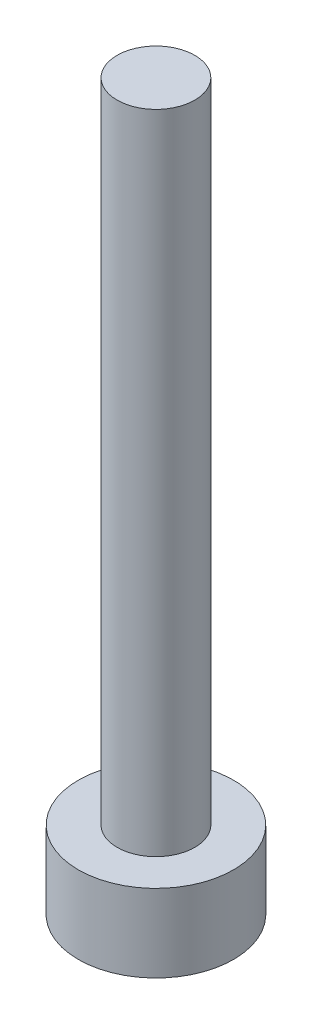
ISO-10303-21;
HEADER;
FILE_DESCRIPTION(('STEP AP214'),'2;1');
FILE_NAME('part.step','',(''),(''),'','','');
FILE_SCHEMA(('AUTOMOTIVE_DESIGN { 1 0 10303 214 1 1 1 1 }'));
ENDSEC;
DATA;
#1=APPLICATION_CONTEXT('core data for automotive mechanical design processes');
#2=APPLICATION_PROTOCOL_DEFINITION('international standard','automotive_design',2000,#1);
#3=PRODUCT_CONTEXT('',#1,'mechanical');
#4=PRODUCT('Part','Part','',(#3));
#5=PRODUCT_RELATED_PRODUCT_CATEGORY('part','',(#4));
#6=PRODUCT_DEFINITION_FORMATION('','',#4);
#7=PRODUCT_DEFINITION_CONTEXT('part definition',#1,'design');
#8=PRODUCT_DEFINITION('design','',#6,#7);
#9=PRODUCT_DEFINITION_SHAPE('','',#8);
#10=(LENGTH_UNIT() NAMED_UNIT(*) SI_UNIT(.MILLI.,.METRE.));
#11=(NAMED_UNIT(*) PLANE_ANGLE_UNIT() SI_UNIT($,.RADIAN.));
#12=(NAMED_UNIT(*) SI_UNIT($,.STERADIAN.) SOLID_ANGLE_UNIT());
#13=UNCERTAINTY_MEASURE_WITH_UNIT(LENGTH_MEASURE(1.E-05),#10,'distance_accuracy_value','');
#14=(GEOMETRIC_REPRESENTATION_CONTEXT(3) GLOBAL_UNCERTAINTY_ASSIGNED_CONTEXT((#13)) GLOBAL_UNIT_ASSIGNED_CONTEXT((#10,
#11,#12)) REPRESENTATION_CONTEXT('',''));
#15=CARTESIAN_POINT('',(0.,0.,0.));
#16=DIRECTION('',(0.,0.,1.));
#17=DIRECTION('',(1.,0.,0.));
#18=AXIS2_PLACEMENT_3D('',#15,#16,#17);
#19=CARTESIAN_POINT('',(0.,3.,0.));
#20=DIRECTION('',(0.,-1.,0.));
#21=DIRECTION('',(0.,0.,-1.));
#22=AXIS2_PLACEMENT_3D('',#19,#20,#21);
#23=CYLINDRICAL_SURFACE('',#22,3.);
#24=CARTESIAN_POINT('',(0.,3.,0.));
#25=DIRECTION('',(0.,1.,0.));
#26=DIRECTION('',(0.,0.,1.));
#27=AXIS2_PLACEMENT_3D('',#24,#25,#26);
#28=CIRCLE('',#27,3.);
#29=CARTESIAN_POINT('',(0.,3.,3.));
#30=VERTEX_POINT('',#29);
#31=EDGE_CURVE('E39',#30,#30,#28,.T.);
#32=ORIENTED_EDGE('',*,*,#31,.F.);
#33=EDGE_LOOP('',(#32));
#34=FACE_BOUND('',#33,.T.);
#35=CARTESIAN_POINT('',(0.,0.,0.));
#36=DIRECTION('',(0.,1.,0.));
#37=DIRECTION('',(0.,0.,1.));
#38=AXIS2_PLACEMENT_3D('',#35,#36,#37);
#39=CIRCLE('',#38,3.);
#40=CARTESIAN_POINT('',(0.,0.,3.));
#41=VERTEX_POINT('',#40);
#42=EDGE_CURVE('E35',#41,#41,#39,.T.);
#43=ORIENTED_EDGE('',*,*,#42,.T.);
#44=EDGE_LOOP('',(#43));
#45=FACE_BOUND('',#44,.T.);
#46=ADVANCED_FACE('F32',(#34,#45),#23,.T.);
#47=CARTESIAN_POINT('',(0.,3.,0.));
#48=DIRECTION('',(0.,1.,0.));
#49=DIRECTION('',(0.,0.,1.));
#50=AXIS2_PLACEMENT_3D('',#47,#48,#49);
#51=PLANE('',#50);
#52=CARTESIAN_POINT('',(0.,3.,0.));
#53=DIRECTION('',(0.,1.,0.));
#54=DIRECTION('',(0.,0.,1.));
#55=AXIS2_PLACEMENT_3D('',#52,#53,#54);
#56=CIRCLE('',#55,1.5);
#57=CARTESIAN_POINT('',(0.,3.,1.5));
#58=VERTEX_POINT('',#57);
#59=EDGE_CURVE('E10',#58,#58,#56,.T.);
#60=ORIENTED_EDGE('',*,*,#59,.F.);
#61=EDGE_LOOP('',(#60));
#62=FACE_BOUND('',#61,.T.);
#63=ORIENTED_EDGE('',*,*,#31,.T.);
#64=EDGE_LOOP('',(#63));
#65=FACE_BOUND('',#64,.T.);
#66=ADVANCED_FACE('F56',(#62,#65),#51,.T.);
#67=CARTESIAN_POINT('',(0.,0.,0.));
#68=DIRECTION('',(0.,1.,0.));
#69=DIRECTION('',(0.,0.,1.));
#70=AXIS2_PLACEMENT_3D('',#67,#68,#69);
#71=PLANE('',#70);
#72=ORIENTED_EDGE('',*,*,#42,.F.);
#73=EDGE_LOOP('',(#72));
#74=FACE_BOUND('',#73,.T.);
#75=ADVANCED_FACE('F53',(#74),#71,.F.);
#76=CARTESIAN_POINT('',(0.,28.,0.));
#77=DIRECTION('',(0.,-1.,0.));
#78=DIRECTION('',(0.,0.,-1.));
#79=AXIS2_PLACEMENT_3D('',#76,#77,#78);
#80=CYLINDRICAL_SURFACE('',#79,1.5);
#81=CARTESIAN_POINT('',(0.,28.,0.));
#82=DIRECTION('',(0.,1.,0.));
#83=DIRECTION('',(0.,0.,1.));
#84=AXIS2_PLACEMENT_3D('',#81,#82,#83);
#85=CIRCLE('',#84,1.5);
#86=CARTESIAN_POINT('',(0.,28.,1.5));
#87=VERTEX_POINT('',#86);
#88=EDGE_CURVE('E45',#87,#87,#85,.T.);
#89=ORIENTED_EDGE('',*,*,#88,.F.);
#90=EDGE_LOOP('',(#89));
#91=FACE_BOUND('',#90,.T.);
#92=ORIENTED_EDGE('',*,*,#59,.T.);
#93=EDGE_LOOP('',(#92));
#94=FACE_BOUND('',#93,.T.);
#95=ADVANCED_FACE('F55',(#91,#94),#80,.T.);
#96=CARTESIAN_POINT('',(0.,28.,0.));
#97=DIRECTION('',(0.,1.,0.));
#98=DIRECTION('',(0.,0.,1.));
#99=AXIS2_PLACEMENT_3D('',#96,#97,#98);
#100=PLANE('',#99);
#101=ORIENTED_EDGE('',*,*,#88,.T.);
#102=EDGE_LOOP('',(#101));
#103=FACE_BOUND('',#102,.T.);
#104=ADVANCED_FACE('F61',(#103),#100,.T.);
#105=CLOSED_SHELL('',(#46,#66,#75,#95,#104));
#106=MANIFOLD_SOLID_BREP('B2',#105);
#107=ADVANCED_BREP_SHAPE_REPRESENTATION('',(#18,#106),#14);
#108=SHAPE_DEFINITION_REPRESENTATION(#9,#107);
ENDSEC;
END-ISO-10303-21;
